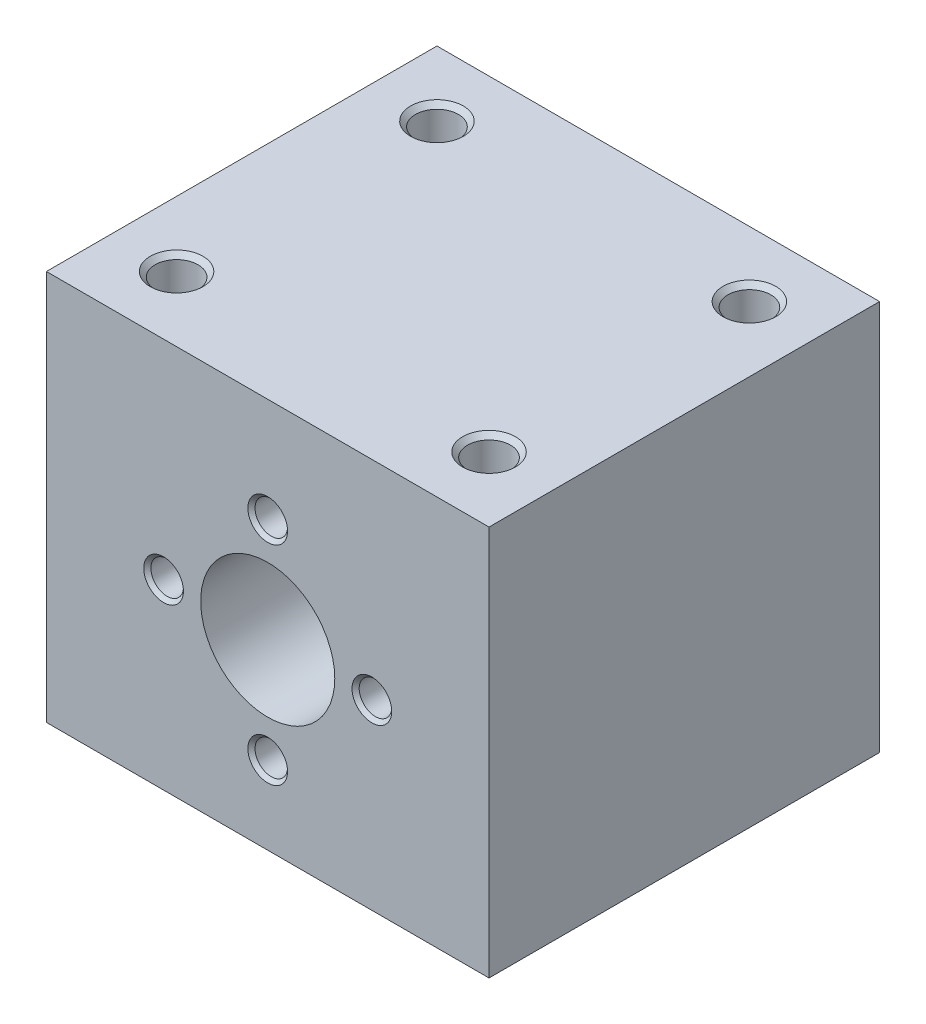
ISO-10303-21;
HEADER;
FILE_DESCRIPTION(('STEP AP214'),'2;1');
FILE_NAME('part.step','',(''),(''),'','','');
FILE_SCHEMA(('AUTOMOTIVE_DESIGN { 1 0 10303 214 1 1 1 1 }'));
ENDSEC;
DATA;
#1=APPLICATION_CONTEXT('core data for automotive mechanical design processes');
#2=APPLICATION_PROTOCOL_DEFINITION('international standard','automotive_design',2000,#1);
#3=PRODUCT_CONTEXT('',#1,'mechanical');
#4=PRODUCT('Part','Part','',(#3));
#5=PRODUCT_RELATED_PRODUCT_CATEGORY('part','',(#4));
#6=PRODUCT_DEFINITION_FORMATION('','',#4);
#7=PRODUCT_DEFINITION_CONTEXT('part definition',#1,'design');
#8=PRODUCT_DEFINITION('design','',#6,#7);
#9=PRODUCT_DEFINITION_SHAPE('','',#8);
#10=(LENGTH_UNIT() NAMED_UNIT(*) SI_UNIT(.MILLI.,.METRE.));
#11=(NAMED_UNIT(*) PLANE_ANGLE_UNIT() SI_UNIT($,.RADIAN.));
#12=(NAMED_UNIT(*) SI_UNIT($,.STERADIAN.) SOLID_ANGLE_UNIT());
#13=UNCERTAINTY_MEASURE_WITH_UNIT(LENGTH_MEASURE(1.E-05),#10,'distance_accuracy_value','');
#14=(GEOMETRIC_REPRESENTATION_CONTEXT(3) GLOBAL_UNCERTAINTY_ASSIGNED_CONTEXT((#13)) GLOBAL_UNIT_ASSIGNED_CONTEXT((#10,
#11,#12)) REPRESENTATION_CONTEXT('',''));
#15=CARTESIAN_POINT('',(0.,0.,0.));
#16=DIRECTION('',(0.,0.,1.));
#17=DIRECTION('',(1.,0.,0.));
#18=AXIS2_PLACEMENT_3D('',#15,#16,#17);
#19=CARTESIAN_POINT('',(0.,0.,30.));
#20=DIRECTION('',(0.,0.,-1.));
#21=DIRECTION('',(-1.,0.,0.));
#22=AXIS2_PLACEMENT_3D('',#19,#20,#21);
#23=PLANE('',#22);
#24=CARTESIAN_POINT('',(0.,8.,30.));
#25=DIRECTION('',(0.,0.,1.));
#26=DIRECTION('',(1.,0.,0.));
#27=AXIS2_PLACEMENT_3D('',#24,#25,#26);
#28=CIRCLE('',#27,1.525);
#29=CARTESIAN_POINT('',(1.525,8.,30.));
#30=VERTEX_POINT('',#29);
#31=EDGE_CURVE('E137',#30,#30,#28,.T.);
#32=ORIENTED_EDGE('',*,*,#31,.F.);
#33=EDGE_LOOP('',(#32));
#34=FACE_BOUND('',#33,.T.);
#35=CARTESIAN_POINT('',(-8.,0.,30.));
#36=DIRECTION('',(0.,0.,1.));
#37=DIRECTION('',(1.,0.,0.));
#38=AXIS2_PLACEMENT_3D('',#35,#36,#37);
#39=CIRCLE('',#38,1.525);
#40=CARTESIAN_POINT('',(-6.475,0.,30.));
#41=VERTEX_POINT('',#40);
#42=EDGE_CURVE('E128',#41,#41,#39,.T.);
#43=ORIENTED_EDGE('',*,*,#42,.F.);
#44=EDGE_LOOP('',(#43));
#45=FACE_BOUND('',#44,.T.);
#46=CARTESIAN_POINT('',(8.,0.,30.));
#47=DIRECTION('',(0.,0.,1.));
#48=DIRECTION('',(1.,0.,0.));
#49=AXIS2_PLACEMENT_3D('',#46,#47,#48);
#50=CIRCLE('',#49,1.525);
#51=CARTESIAN_POINT('',(9.525,0.,30.));
#52=VERTEX_POINT('',#51);
#53=EDGE_CURVE('E148',#52,#52,#50,.T.);
#54=ORIENTED_EDGE('',*,*,#53,.F.);
#55=EDGE_LOOP('',(#54));
#56=FACE_BOUND('',#55,.T.);
#57=CARTESIAN_POINT('',(0.,-8.,30.));
#58=DIRECTION('',(0.,0.,1.));
#59=DIRECTION('',(1.,0.,0.));
#60=AXIS2_PLACEMENT_3D('',#57,#58,#59);
#61=CIRCLE('',#60,1.525);
#62=CARTESIAN_POINT('',(1.525,-8.,30.));
#63=VERTEX_POINT('',#62);
#64=EDGE_CURVE('E160',#63,#63,#61,.T.);
#65=ORIENTED_EDGE('',*,*,#64,.F.);
#66=EDGE_LOOP('',(#65));
#67=FACE_BOUND('',#66,.T.);
#68=DIRECTION('',(0.,-1.,0.));
#69=VECTOR('',#68,1.);
#70=CARTESIAN_POINT('',(-17.,-14.,30.));
#71=LINE('',#70,#69);
#72=CARTESIAN_POINT('',(-17.,16.,30.));
#73=VERTEX_POINT('',#72);
#74=CARTESIAN_POINT('',(-17.,-14.,30.));
#75=VERTEX_POINT('',#74);
#76=EDGE_CURVE('E229',#73,#75,#71,.T.);
#77=ORIENTED_EDGE('',*,*,#76,.T.);
#78=DIRECTION('',(1.,0.,0.));
#79=VECTOR('',#78,1.);
#80=CARTESIAN_POINT('',(-17.,-14.,30.));
#81=LINE('',#80,#79);
#82=CARTESIAN_POINT('',(17.,-14.,30.));
#83=VERTEX_POINT('',#82);
#84=EDGE_CURVE('E92',#75,#83,#81,.T.);
#85=ORIENTED_EDGE('',*,*,#84,.T.);
#86=DIRECTION('',(0.,1.,0.));
#87=VECTOR('',#86,1.);
#88=CARTESIAN_POINT('',(17.,-14.,30.));
#89=LINE('',#88,#87);
#90=CARTESIAN_POINT('',(17.,16.,30.));
#91=VERTEX_POINT('',#90);
#92=EDGE_CURVE('E234',#83,#91,#89,.T.);
#93=ORIENTED_EDGE('',*,*,#92,.T.);
#94=DIRECTION('',(-1.,0.,0.));
#95=VECTOR('',#94,1.);
#96=CARTESIAN_POINT('',(-17.,16.,30.));
#97=LINE('',#96,#95);
#98=EDGE_CURVE('E61',#91,#73,#97,.T.);
#99=ORIENTED_EDGE('',*,*,#98,.T.);
#100=EDGE_LOOP('',(#77,#85,#93,#99));
#101=FACE_BOUND('',#100,.T.);
#102=CARTESIAN_POINT('',(0.,0.,30.));
#103=DIRECTION('',(0.,0.,1.));
#104=DIRECTION('',(1.,0.,0.));
#105=AXIS2_PLACEMENT_3D('',#102,#103,#104);
#106=CIRCLE('',#105,5.15);
#107=CARTESIAN_POINT('',(5.15,0.,30.));
#108=VERTEX_POINT('',#107);
#109=EDGE_CURVE('E221',#108,#108,#106,.T.);
#110=ORIENTED_EDGE('',*,*,#109,.F.);
#111=EDGE_LOOP('',(#110));
#112=FACE_BOUND('',#111,.T.);
#113=ADVANCED_FACE('F43',(#34,#45,#56,#67,#101,#112),#23,.F.);
#114=CARTESIAN_POINT('',(0.,0.,0.));
#115=DIRECTION('',(0.,0.,-1.));
#116=DIRECTION('',(-1.,0.,0.));
#117=AXIS2_PLACEMENT_3D('',#114,#115,#116);
#118=PLANE('',#117);
#119=DIRECTION('',(0.,-1.,0.));
#120=VECTOR('',#119,1.);
#121=CARTESIAN_POINT('',(-17.,-14.,0.));
#122=LINE('',#121,#120);
#123=CARTESIAN_POINT('',(-17.,16.,0.));
#124=VERTEX_POINT('',#123);
#125=CARTESIAN_POINT('',(-17.,-14.,0.));
#126=VERTEX_POINT('',#125);
#127=EDGE_CURVE('E225',#124,#126,#122,.T.);
#128=ORIENTED_EDGE('',*,*,#127,.F.);
#129=DIRECTION('',(-1.,0.,0.));
#130=VECTOR('',#129,1.);
#131=CARTESIAN_POINT('',(-17.,16.,0.));
#132=LINE('',#131,#130);
#133=CARTESIAN_POINT('',(17.,16.,0.));
#134=VERTEX_POINT('',#133);
#135=EDGE_CURVE('E85',#134,#124,#132,.T.);
#136=ORIENTED_EDGE('',*,*,#135,.F.);
#137=DIRECTION('',(0.,1.,0.));
#138=VECTOR('',#137,1.);
#139=CARTESIAN_POINT('',(17.,-14.,0.));
#140=LINE('',#139,#138);
#141=CARTESIAN_POINT('',(17.,-14.,0.));
#142=VERTEX_POINT('',#141);
#143=EDGE_CURVE('E79',#142,#134,#140,.T.);
#144=ORIENTED_EDGE('',*,*,#143,.F.);
#145=DIRECTION('',(1.,0.,0.));
#146=VECTOR('',#145,1.);
#147=CARTESIAN_POINT('',(-17.,-14.,0.));
#148=LINE('',#147,#146);
#149=EDGE_CURVE('E243',#126,#142,#148,.T.);
#150=ORIENTED_EDGE('',*,*,#149,.F.);
#151=EDGE_LOOP('',(#128,#136,#144,#150));
#152=FACE_BOUND('',#151,.T.);
#153=CARTESIAN_POINT('',(0.,0.,0.));
#154=DIRECTION('',(0.,0.,1.));
#155=DIRECTION('',(1.,0.,0.));
#156=AXIS2_PLACEMENT_3D('',#153,#154,#155);
#157=CIRCLE('',#156,5.15);
#158=CARTESIAN_POINT('',(5.15,0.,0.));
#159=VERTEX_POINT('',#158);
#160=EDGE_CURVE('E220',#159,#159,#157,.T.);
#161=ORIENTED_EDGE('',*,*,#160,.T.);
#162=EDGE_LOOP('',(#161));
#163=FACE_BOUND('',#162,.T.);
#164=ADVANCED_FACE('F259',(#152,#163),#118,.T.);
#165=CARTESIAN_POINT('',(-17.,-14.,30.));
#166=DIRECTION('',(1.,0.,0.));
#167=DIRECTION('',(0.,1.,0.));
#168=AXIS2_PLACEMENT_3D('',#165,#166,#167);
#169=PLANE('',#168);
#170=ORIENTED_EDGE('',*,*,#127,.T.);
#171=DIRECTION('',(0.,0.,-1.));
#172=VECTOR('',#171,1.);
#173=CARTESIAN_POINT('',(-17.,-14.,30.));
#174=LINE('',#173,#172);
#175=EDGE_CURVE('E11',#75,#126,#174,.T.);
#176=ORIENTED_EDGE('',*,*,#175,.F.);
#177=ORIENTED_EDGE('',*,*,#76,.F.);
#178=DIRECTION('',(0.,0.,-1.));
#179=VECTOR('',#178,1.);
#180=CARTESIAN_POINT('',(-17.,16.,30.));
#181=LINE('',#180,#179);
#182=EDGE_CURVE('E239',#73,#124,#181,.T.);
#183=ORIENTED_EDGE('',*,*,#182,.T.);
#184=EDGE_LOOP('',(#170,#176,#177,#183));
#185=FACE_BOUND('',#184,.T.);
#186=ADVANCED_FACE('F45',(#185),#169,.F.);
#187=CARTESIAN_POINT('',(-17.,-14.,30.));
#188=DIRECTION('',(0.,1.,0.));
#189=DIRECTION('',(-1.,0.,0.));
#190=AXIS2_PLACEMENT_3D('',#187,#188,#189);
#191=PLANE('',#190);
#192=ORIENTED_EDGE('',*,*,#149,.T.);
#193=DIRECTION('',(0.,0.,-1.));
#194=VECTOR('',#193,1.);
#195=CARTESIAN_POINT('',(17.,-14.,30.));
#196=LINE('',#195,#194);
#197=EDGE_CURVE('E53',#83,#142,#196,.T.);
#198=ORIENTED_EDGE('',*,*,#197,.F.);
#199=ORIENTED_EDGE('',*,*,#84,.F.);
#200=ORIENTED_EDGE('',*,*,#175,.T.);
#201=EDGE_LOOP('',(#192,#198,#199,#200));
#202=FACE_BOUND('',#201,.T.);
#203=ADVANCED_FACE('F276',(#202),#191,.F.);
#204=CARTESIAN_POINT('',(17.,-14.,30.));
#205=DIRECTION('',(-1.,0.,0.));
#206=DIRECTION('',(0.,-1.,0.));
#207=AXIS2_PLACEMENT_3D('',#204,#205,#206);
#208=PLANE('',#207);
#209=ORIENTED_EDGE('',*,*,#143,.T.);
#210=DIRECTION('',(0.,0.,-1.));
#211=VECTOR('',#210,1.);
#212=CARTESIAN_POINT('',(17.,16.,30.));
#213=LINE('',#212,#211);
#214=EDGE_CURVE('E252',#91,#134,#213,.T.);
#215=ORIENTED_EDGE('',*,*,#214,.F.);
#216=ORIENTED_EDGE('',*,*,#92,.F.);
#217=ORIENTED_EDGE('',*,*,#197,.T.);
#218=EDGE_LOOP('',(#209,#215,#216,#217));
#219=FACE_BOUND('',#218,.T.);
#220=ADVANCED_FACE('F256',(#219),#208,.F.);
#221=CARTESIAN_POINT('',(-17.,16.,30.));
#222=DIRECTION('',(0.,-1.,0.));
#223=DIRECTION('',(1.,0.,0.));
#224=AXIS2_PLACEMENT_3D('',#221,#222,#223);
#225=PLANE('',#224);
#226=CARTESIAN_POINT('',(-12.,16.,5.));
#227=DIRECTION('',(0.,1.,0.));
#228=DIRECTION('',(0.,0.,1.));
#229=AXIS2_PLACEMENT_3D('',#226,#227,#228);
#230=CIRCLE('',#229,2.025);
#231=CARTESIAN_POINT('',(-12.,16.,7.025));
#232=VERTEX_POINT('',#231);
#233=EDGE_CURVE('E172',#232,#232,#230,.T.);
#234=ORIENTED_EDGE('',*,*,#233,.F.);
#235=EDGE_LOOP('',(#234));
#236=FACE_BOUND('',#235,.T.);
#237=CARTESIAN_POINT('',(12.,16.,5.));
#238=DIRECTION('',(0.,1.,0.));
#239=DIRECTION('',(0.,0.,1.));
#240=AXIS2_PLACEMENT_3D('',#237,#238,#239);
#241=CIRCLE('',#240,2.025);
#242=CARTESIAN_POINT('',(12.,16.,7.025));
#243=VERTEX_POINT('',#242);
#244=EDGE_CURVE('E184',#243,#243,#241,.T.);
#245=ORIENTED_EDGE('',*,*,#244,.F.);
#246=EDGE_LOOP('',(#245));
#247=FACE_BOUND('',#246,.T.);
#248=CARTESIAN_POINT('',(-12.,16.,25.));
#249=DIRECTION('',(0.,1.,0.));
#250=DIRECTION('',(0.,0.,1.));
#251=AXIS2_PLACEMENT_3D('',#248,#249,#250);
#252=CIRCLE('',#251,2.025);
#253=CARTESIAN_POINT('',(-12.,16.,27.025));
#254=VERTEX_POINT('',#253);
#255=EDGE_CURVE('E196',#254,#254,#252,.T.);
#256=ORIENTED_EDGE('',*,*,#255,.F.);
#257=EDGE_LOOP('',(#256));
#258=FACE_BOUND('',#257,.T.);
#259=CARTESIAN_POINT('',(12.,16.,25.));
#260=DIRECTION('',(0.,1.,0.));
#261=DIRECTION('',(0.,0.,1.));
#262=AXIS2_PLACEMENT_3D('',#259,#260,#261);
#263=CIRCLE('',#262,2.025);
#264=CARTESIAN_POINT('',(12.,16.,27.025));
#265=VERTEX_POINT('',#264);
#266=EDGE_CURVE('E208',#265,#265,#263,.T.);
#267=ORIENTED_EDGE('',*,*,#266,.F.);
#268=EDGE_LOOP('',(#267));
#269=FACE_BOUND('',#268,.T.);
#270=ORIENTED_EDGE('',*,*,#135,.T.);
#271=ORIENTED_EDGE('',*,*,#182,.F.);
#272=ORIENTED_EDGE('',*,*,#98,.F.);
#273=ORIENTED_EDGE('',*,*,#214,.T.);
#274=EDGE_LOOP('',(#270,#271,#272,#273));
#275=FACE_BOUND('',#274,.T.);
#276=ADVANCED_FACE('F264',(#236,#247,#258,#269,#275),#225,.F.);
#277=CARTESIAN_POINT('',(0.,0.,30.));
#278=DIRECTION('',(0.,0.,-1.));
#279=DIRECTION('',(-1.,0.,0.));
#280=AXIS2_PLACEMENT_3D('',#277,#278,#279);
#281=CYLINDRICAL_SURFACE('',#280,5.15);
#282=ORIENTED_EDGE('',*,*,#109,.T.);
#283=EDGE_LOOP('',(#282));
#284=FACE_BOUND('',#283,.T.);
#285=ORIENTED_EDGE('',*,*,#160,.F.);
#286=EDGE_LOOP('',(#285));
#287=FACE_BOUND('',#286,.T.);
#288=ADVANCED_FACE('F266',(#284,#287),#281,.F.);
#289=CARTESIAN_POINT('',(12.,3.9,25.));
#290=DIRECTION('',(0.,1.,0.));
#291=DIRECTION('',(0.,0.,1.));
#292=AXIS2_PLACEMENT_3D('',#289,#290,#291);
#293=CONICAL_SURFACE('',#292,1.64999999999999,1.02974425867665);
#294=CARTESIAN_POINT('',(12.,2.90857997860452,25.));
#295=VERTEX_POINT('',#294);
#296=VERTEX_LOOP('',#295);
#297=FACE_BOUND('',#296,.T.);
#298=CARTESIAN_POINT('',(12.,3.9,25.));
#299=DIRECTION('',(0.,1.,0.));
#300=DIRECTION('',(0.,0.,1.));
#301=AXIS2_PLACEMENT_3D('',#298,#299,#300);
#302=CIRCLE('',#301,1.64999999999999);
#303=CARTESIAN_POINT('',(12.,3.9,26.65));
#304=VERTEX_POINT('',#303);
#305=EDGE_CURVE('E216',#304,#304,#302,.T.);
#306=ORIENTED_EDGE('',*,*,#305,.T.);
#307=EDGE_LOOP('',(#306));
#308=FACE_BOUND('',#307,.T.);
#309=ADVANCED_FACE('F273',(#297,#308),#293,.F.);
#310=CARTESIAN_POINT('',(12.,16.,25.));
#311=DIRECTION('',(0.,1.,0.));
#312=DIRECTION('',(0.,0.,1.));
#313=AXIS2_PLACEMENT_3D('',#310,#311,#312);
#314=CYLINDRICAL_SURFACE('',#313,1.64999999999999);
#315=ORIENTED_EDGE('',*,*,#305,.F.);
#316=EDGE_LOOP('',(#315));
#317=FACE_BOUND('',#316,.T.);
#318=CARTESIAN_POINT('',(12.,15.625,25.));
#319=DIRECTION('',(0.,1.,0.));
#320=DIRECTION('',(0.,0.,1.));
#321=AXIS2_PLACEMENT_3D('',#318,#319,#320);
#322=CIRCLE('',#321,1.64999999999999);
#323=CARTESIAN_POINT('',(12.,15.625,26.65));
#324=VERTEX_POINT('',#323);
#325=EDGE_CURVE('E212',#324,#324,#322,.T.);
#326=ORIENTED_EDGE('',*,*,#325,.T.);
#327=EDGE_LOOP('',(#326));
#328=FACE_BOUND('',#327,.T.);
#329=ADVANCED_FACE('F292',(#317,#328),#314,.F.);
#330=CARTESIAN_POINT('',(12.,16.,25.));
#331=DIRECTION('',(0.,1.,0.));
#332=DIRECTION('',(0.,0.,1.));
#333=AXIS2_PLACEMENT_3D('',#330,#331,#332);
#334=CONICAL_SURFACE('',#333,2.025,0.785398163397455);
#335=ORIENTED_EDGE('',*,*,#325,.F.);
#336=EDGE_LOOP('',(#335));
#337=FACE_BOUND('',#336,.T.);
#338=ORIENTED_EDGE('',*,*,#266,.T.);
#339=EDGE_LOOP('',(#338));
#340=FACE_BOUND('',#339,.T.);
#341=ADVANCED_FACE('F296',(#337,#340),#334,.F.);
#342=CARTESIAN_POINT('',(-12.,3.9,25.));
#343=DIRECTION('',(0.,1.,0.));
#344=DIRECTION('',(0.,0.,1.));
#345=AXIS2_PLACEMENT_3D('',#342,#343,#344);
#346=CONICAL_SURFACE('',#345,1.64999999999999,1.02974425867665);
#347=CARTESIAN_POINT('',(-12.,2.90857997860452,25.));
#348=VERTEX_POINT('',#347);
#349=VERTEX_LOOP('',#348);
#350=FACE_BOUND('',#349,.T.);
#351=CARTESIAN_POINT('',(-12.,3.9,25.));
#352=DIRECTION('',(0.,1.,0.));
#353=DIRECTION('',(0.,0.,1.));
#354=AXIS2_PLACEMENT_3D('',#351,#352,#353);
#355=CIRCLE('',#354,1.64999999999999);
#356=CARTESIAN_POINT('',(-12.,3.9,26.65));
#357=VERTEX_POINT('',#356);
#358=EDGE_CURVE('E204',#357,#357,#355,.T.);
#359=ORIENTED_EDGE('',*,*,#358,.T.);
#360=EDGE_LOOP('',(#359));
#361=FACE_BOUND('',#360,.T.);
#362=ADVANCED_FACE('F300',(#350,#361),#346,.F.);
#363=CARTESIAN_POINT('',(-12.,16.,25.));
#364=DIRECTION('',(0.,1.,0.));
#365=DIRECTION('',(0.,0.,1.));
#366=AXIS2_PLACEMENT_3D('',#363,#364,#365);
#367=CYLINDRICAL_SURFACE('',#366,1.64999999999999);
#368=ORIENTED_EDGE('',*,*,#358,.F.);
#369=EDGE_LOOP('',(#368));
#370=FACE_BOUND('',#369,.T.);
#371=CARTESIAN_POINT('',(-12.,15.625,25.));
#372=DIRECTION('',(0.,1.,0.));
#373=DIRECTION('',(0.,0.,1.));
#374=AXIS2_PLACEMENT_3D('',#371,#372,#373);
#375=CIRCLE('',#374,1.64999999999999);
#376=CARTESIAN_POINT('',(-12.,15.625,26.65));
#377=VERTEX_POINT('',#376);
#378=EDGE_CURVE('E200',#377,#377,#375,.T.);
#379=ORIENTED_EDGE('',*,*,#378,.T.);
#380=EDGE_LOOP('',(#379));
#381=FACE_BOUND('',#380,.T.);
#382=ADVANCED_FACE('F304',(#370,#381),#367,.F.);
#383=CARTESIAN_POINT('',(-12.,16.,25.));
#384=DIRECTION('',(0.,1.,0.));
#385=DIRECTION('',(0.,0.,1.));
#386=AXIS2_PLACEMENT_3D('',#383,#384,#385);
#387=CONICAL_SURFACE('',#386,2.025,0.785398163397455);
#388=ORIENTED_EDGE('',*,*,#378,.F.);
#389=EDGE_LOOP('',(#388));
#390=FACE_BOUND('',#389,.T.);
#391=ORIENTED_EDGE('',*,*,#255,.T.);
#392=EDGE_LOOP('',(#391));
#393=FACE_BOUND('',#392,.T.);
#394=ADVANCED_FACE('F308',(#390,#393),#387,.F.);
#395=CARTESIAN_POINT('',(12.,3.9,5.));
#396=DIRECTION('',(0.,1.,0.));
#397=DIRECTION('',(0.,0.,1.));
#398=AXIS2_PLACEMENT_3D('',#395,#396,#397);
#399=CONICAL_SURFACE('',#398,1.64999999999999,1.02974425867665);
#400=CARTESIAN_POINT('',(12.,2.90857997860452,5.));
#401=VERTEX_POINT('',#400);
#402=VERTEX_LOOP('',#401);
#403=FACE_BOUND('',#402,.T.);
#404=CARTESIAN_POINT('',(12.,3.9,5.));
#405=DIRECTION('',(0.,1.,0.));
#406=DIRECTION('',(0.,0.,1.));
#407=AXIS2_PLACEMENT_3D('',#404,#405,#406);
#408=CIRCLE('',#407,1.64999999999999);
#409=CARTESIAN_POINT('',(12.,3.9,6.64999999999999));
#410=VERTEX_POINT('',#409);
#411=EDGE_CURVE('E192',#410,#410,#408,.T.);
#412=ORIENTED_EDGE('',*,*,#411,.T.);
#413=EDGE_LOOP('',(#412));
#414=FACE_BOUND('',#413,.T.);
#415=ADVANCED_FACE('F312',(#403,#414),#399,.F.);
#416=CARTESIAN_POINT('',(12.,16.,5.));
#417=DIRECTION('',(0.,1.,0.));
#418=DIRECTION('',(0.,0.,1.));
#419=AXIS2_PLACEMENT_3D('',#416,#417,#418);
#420=CYLINDRICAL_SURFACE('',#419,1.64999999999999);
#421=ORIENTED_EDGE('',*,*,#411,.F.);
#422=EDGE_LOOP('',(#421));
#423=FACE_BOUND('',#422,.T.);
#424=CARTESIAN_POINT('',(12.,15.625,5.));
#425=DIRECTION('',(0.,1.,0.));
#426=DIRECTION('',(0.,0.,1.));
#427=AXIS2_PLACEMENT_3D('',#424,#425,#426);
#428=CIRCLE('',#427,1.64999999999999);
#429=CARTESIAN_POINT('',(12.,15.625,6.64999999999999));
#430=VERTEX_POINT('',#429);
#431=EDGE_CURVE('E188',#430,#430,#428,.T.);
#432=ORIENTED_EDGE('',*,*,#431,.T.);
#433=EDGE_LOOP('',(#432));
#434=FACE_BOUND('',#433,.T.);
#435=ADVANCED_FACE('F316',(#423,#434),#420,.F.);
#436=CARTESIAN_POINT('',(12.,16.,5.));
#437=DIRECTION('',(0.,1.,0.));
#438=DIRECTION('',(0.,0.,1.));
#439=AXIS2_PLACEMENT_3D('',#436,#437,#438);
#440=CONICAL_SURFACE('',#439,2.025,0.785398163397455);
#441=ORIENTED_EDGE('',*,*,#431,.F.);
#442=EDGE_LOOP('',(#441));
#443=FACE_BOUND('',#442,.T.);
#444=ORIENTED_EDGE('',*,*,#244,.T.);
#445=EDGE_LOOP('',(#444));
#446=FACE_BOUND('',#445,.T.);
#447=ADVANCED_FACE('F320',(#443,#446),#440,.F.);
#448=CARTESIAN_POINT('',(-12.,3.9,5.));
#449=DIRECTION('',(0.,1.,0.));
#450=DIRECTION('',(0.,0.,1.));
#451=AXIS2_PLACEMENT_3D('',#448,#449,#450);
#452=CONICAL_SURFACE('',#451,1.64999999999999,1.02974425867665);
#453=CARTESIAN_POINT('',(-12.,2.90857997860452,5.));
#454=VERTEX_POINT('',#453);
#455=VERTEX_LOOP('',#454);
#456=FACE_BOUND('',#455,.T.);
#457=CARTESIAN_POINT('',(-12.,3.9,5.));
#458=DIRECTION('',(0.,1.,0.));
#459=DIRECTION('',(0.,0.,1.));
#460=AXIS2_PLACEMENT_3D('',#457,#458,#459);
#461=CIRCLE('',#460,1.64999999999999);
#462=CARTESIAN_POINT('',(-12.,3.9,6.64999999999999));
#463=VERTEX_POINT('',#462);
#464=EDGE_CURVE('E180',#463,#463,#461,.T.);
#465=ORIENTED_EDGE('',*,*,#464,.T.);
#466=EDGE_LOOP('',(#465));
#467=FACE_BOUND('',#466,.T.);
#468=ADVANCED_FACE('F324',(#456,#467),#452,.F.);
#469=CARTESIAN_POINT('',(-12.,16.,5.));
#470=DIRECTION('',(0.,1.,0.));
#471=DIRECTION('',(0.,0.,1.));
#472=AXIS2_PLACEMENT_3D('',#469,#470,#471);
#473=CYLINDRICAL_SURFACE('',#472,1.64999999999999);
#474=ORIENTED_EDGE('',*,*,#464,.F.);
#475=EDGE_LOOP('',(#474));
#476=FACE_BOUND('',#475,.T.);
#477=CARTESIAN_POINT('',(-12.,15.625,5.));
#478=DIRECTION('',(0.,1.,0.));
#479=DIRECTION('',(0.,0.,1.));
#480=AXIS2_PLACEMENT_3D('',#477,#478,#479);
#481=CIRCLE('',#480,1.64999999999999);
#482=CARTESIAN_POINT('',(-12.,15.625,6.64999999999999));
#483=VERTEX_POINT('',#482);
#484=EDGE_CURVE('E176',#483,#483,#481,.T.);
#485=ORIENTED_EDGE('',*,*,#484,.T.);
#486=EDGE_LOOP('',(#485));
#487=FACE_BOUND('',#486,.T.);
#488=ADVANCED_FACE('F328',(#476,#487),#473,.F.);
#489=CARTESIAN_POINT('',(-12.,16.,5.));
#490=DIRECTION('',(0.,1.,0.));
#491=DIRECTION('',(0.,0.,1.));
#492=AXIS2_PLACEMENT_3D('',#489,#490,#491);
#493=CONICAL_SURFACE('',#492,2.025,0.785398163397455);
#494=ORIENTED_EDGE('',*,*,#484,.F.);
#495=EDGE_LOOP('',(#494));
#496=FACE_BOUND('',#495,.T.);
#497=ORIENTED_EDGE('',*,*,#233,.T.);
#498=EDGE_LOOP('',(#497));
#499=FACE_BOUND('',#498,.T.);
#500=ADVANCED_FACE('F332',(#496,#499),#493,.F.);
#501=CARTESIAN_POINT('',(0.,-8.,22.5));
#502=DIRECTION('',(0.,0.,1.));
#503=DIRECTION('',(1.,0.,0.));
#504=AXIS2_PLACEMENT_3D('',#501,#502,#503);
#505=CONICAL_SURFACE('',#504,1.25,1.02974425867665);
#506=CARTESIAN_POINT('',(0.,-8.,21.7489242262155));
#507=VERTEX_POINT('',#506);
#508=VERTEX_LOOP('',#507);
#509=FACE_BOUND('',#508,.T.);
#510=CARTESIAN_POINT('',(0.,-8.,22.5));
#511=DIRECTION('',(0.,0.,1.));
#512=DIRECTION('',(1.,0.,0.));
#513=AXIS2_PLACEMENT_3D('',#510,#511,#512);
#514=CIRCLE('',#513,1.25);
#515=CARTESIAN_POINT('',(1.25,-8.,22.5));
#516=VERTEX_POINT('',#515);
#517=EDGE_CURVE('E168',#516,#516,#514,.T.);
#518=ORIENTED_EDGE('',*,*,#517,.T.);
#519=EDGE_LOOP('',(#518));
#520=FACE_BOUND('',#519,.T.);
#521=ADVANCED_FACE('F336',(#509,#520),#505,.F.);
#522=CARTESIAN_POINT('',(0.,-8.,30.));
#523=DIRECTION('',(0.,0.,1.));
#524=DIRECTION('',(1.,0.,0.));
#525=AXIS2_PLACEMENT_3D('',#522,#523,#524);
#526=CYLINDRICAL_SURFACE('',#525,1.25);
#527=ORIENTED_EDGE('',*,*,#517,.F.);
#528=EDGE_LOOP('',(#527));
#529=FACE_BOUND('',#528,.T.);
#530=CARTESIAN_POINT('',(0.,-8.,29.725));
#531=DIRECTION('',(0.,0.,1.));
#532=DIRECTION('',(1.,0.,0.));
#533=AXIS2_PLACEMENT_3D('',#530,#531,#532);
#534=CIRCLE('',#533,1.25);
#535=CARTESIAN_POINT('',(1.25,-8.,29.725));
#536=VERTEX_POINT('',#535);
#537=EDGE_CURVE('E164',#536,#536,#534,.T.);
#538=ORIENTED_EDGE('',*,*,#537,.T.);
#539=EDGE_LOOP('',(#538));
#540=FACE_BOUND('',#539,.T.);
#541=ADVANCED_FACE('F340',(#529,#540),#526,.F.);
#542=CARTESIAN_POINT('',(0.,-8.,30.));
#543=DIRECTION('',(0.,0.,1.));
#544=DIRECTION('',(1.,0.,0.));
#545=AXIS2_PLACEMENT_3D('',#542,#543,#544);
#546=CONICAL_SURFACE('',#545,1.525,0.785398163397448);
#547=ORIENTED_EDGE('',*,*,#537,.F.);
#548=EDGE_LOOP('',(#547));
#549=FACE_BOUND('',#548,.T.);
#550=ORIENTED_EDGE('',*,*,#64,.T.);
#551=EDGE_LOOP('',(#550));
#552=FACE_BOUND('',#551,.T.);
#553=ADVANCED_FACE('F344',(#549,#552),#546,.F.);
#554=CARTESIAN_POINT('',(8.,0.,22.5));
#555=DIRECTION('',(0.,0.,1.));
#556=DIRECTION('',(1.,0.,0.));
#557=AXIS2_PLACEMENT_3D('',#554,#555,#556);
#558=CONICAL_SURFACE('',#557,1.25,1.02974425867665);
#559=CARTESIAN_POINT('',(8.,0.,21.7489242262155));
#560=VERTEX_POINT('',#559);
#561=VERTEX_LOOP('',#560);
#562=FACE_BOUND('',#561,.T.);
#563=CARTESIAN_POINT('',(8.,0.,22.5));
#564=DIRECTION('',(0.,0.,1.));
#565=DIRECTION('',(1.,0.,0.));
#566=AXIS2_PLACEMENT_3D('',#563,#564,#565);
#567=CIRCLE('',#566,1.25);
#568=CARTESIAN_POINT('',(9.25,0.,22.5));
#569=VERTEX_POINT('',#568);
#570=EDGE_CURVE('E156',#569,#569,#567,.T.);
#571=ORIENTED_EDGE('',*,*,#570,.T.);
#572=EDGE_LOOP('',(#571));
#573=FACE_BOUND('',#572,.T.);
#574=ADVANCED_FACE('F348',(#562,#573),#558,.F.);
#575=CARTESIAN_POINT('',(8.,0.,30.));
#576=DIRECTION('',(0.,0.,1.));
#577=DIRECTION('',(1.,0.,0.));
#578=AXIS2_PLACEMENT_3D('',#575,#576,#577);
#579=CYLINDRICAL_SURFACE('',#578,1.25);
#580=ORIENTED_EDGE('',*,*,#570,.F.);
#581=EDGE_LOOP('',(#580));
#582=FACE_BOUND('',#581,.T.);
#583=CARTESIAN_POINT('',(8.,0.,29.725));
#584=DIRECTION('',(0.,0.,1.));
#585=DIRECTION('',(1.,0.,0.));
#586=AXIS2_PLACEMENT_3D('',#583,#584,#585);
#587=CIRCLE('',#586,1.25);
#588=CARTESIAN_POINT('',(9.25,0.,29.725));
#589=VERTEX_POINT('',#588);
#590=EDGE_CURVE('E152',#589,#589,#587,.T.);
#591=ORIENTED_EDGE('',*,*,#590,.T.);
#592=EDGE_LOOP('',(#591));
#593=FACE_BOUND('',#592,.T.);
#594=ADVANCED_FACE('F352',(#582,#593),#579,.F.);
#595=CARTESIAN_POINT('',(8.,0.,30.));
#596=DIRECTION('',(0.,0.,1.));
#597=DIRECTION('',(1.,0.,0.));
#598=AXIS2_PLACEMENT_3D('',#595,#596,#597);
#599=CONICAL_SURFACE('',#598,1.525,0.785398163397448);
#600=ORIENTED_EDGE('',*,*,#590,.F.);
#601=EDGE_LOOP('',(#600));
#602=FACE_BOUND('',#601,.T.);
#603=ORIENTED_EDGE('',*,*,#53,.T.);
#604=EDGE_LOOP('',(#603));
#605=FACE_BOUND('',#604,.T.);
#606=ADVANCED_FACE('F356',(#602,#605),#599,.F.);
#607=CARTESIAN_POINT('',(-8.,0.,22.5));
#608=DIRECTION('',(0.,0.,1.));
#609=DIRECTION('',(1.,0.,0.));
#610=AXIS2_PLACEMENT_3D('',#607,#608,#609);
#611=CONICAL_SURFACE('',#610,1.25,1.02974425867665);
#612=CARTESIAN_POINT('',(-8.,0.,21.7489242262155));
#613=VERTEX_POINT('',#612);
#614=VERTEX_LOOP('',#613);
#615=FACE_BOUND('',#614,.T.);
#616=CARTESIAN_POINT('',(-8.,0.,22.5));
#617=DIRECTION('',(0.,0.,1.));
#618=DIRECTION('',(1.,0.,0.));
#619=AXIS2_PLACEMENT_3D('',#616,#617,#618);
#620=CIRCLE('',#619,1.25);
#621=CARTESIAN_POINT('',(-6.75,0.,22.5));
#622=VERTEX_POINT('',#621);
#623=EDGE_CURVE('E144',#622,#622,#620,.T.);
#624=ORIENTED_EDGE('',*,*,#623,.T.);
#625=EDGE_LOOP('',(#624));
#626=FACE_BOUND('',#625,.T.);
#627=ADVANCED_FACE('F360',(#615,#626),#611,.F.);
#628=CARTESIAN_POINT('',(-8.,0.,30.));
#629=DIRECTION('',(0.,0.,1.));
#630=DIRECTION('',(1.,0.,0.));
#631=AXIS2_PLACEMENT_3D('',#628,#629,#630);
#632=CYLINDRICAL_SURFACE('',#631,1.25);
#633=ORIENTED_EDGE('',*,*,#623,.F.);
#634=EDGE_LOOP('',(#633));
#635=FACE_BOUND('',#634,.T.);
#636=CARTESIAN_POINT('',(-8.,0.,29.725));
#637=DIRECTION('',(0.,0.,1.));
#638=DIRECTION('',(1.,0.,0.));
#639=AXIS2_PLACEMENT_3D('',#636,#637,#638);
#640=CIRCLE('',#639,1.25);
#641=CARTESIAN_POINT('',(-6.75,0.,29.725));
#642=VERTEX_POINT('',#641);
#643=EDGE_CURVE('E134',#642,#642,#640,.T.);
#644=ORIENTED_EDGE('',*,*,#643,.T.);
#645=EDGE_LOOP('',(#644));
#646=FACE_BOUND('',#645,.T.);
#647=ADVANCED_FACE('F364',(#635,#646),#632,.F.);
#648=CARTESIAN_POINT('',(-8.,0.,30.));
#649=DIRECTION('',(0.,0.,1.));
#650=DIRECTION('',(1.,0.,0.));
#651=AXIS2_PLACEMENT_3D('',#648,#649,#650);
#652=CONICAL_SURFACE('',#651,1.525,0.785398163397448);
#653=ORIENTED_EDGE('',*,*,#643,.F.);
#654=EDGE_LOOP('',(#653));
#655=FACE_BOUND('',#654,.T.);
#656=ORIENTED_EDGE('',*,*,#42,.T.);
#657=EDGE_LOOP('',(#656));
#658=FACE_BOUND('',#657,.T.);
#659=ADVANCED_FACE('F121',(#655,#658),#652,.F.);
#660=CARTESIAN_POINT('',(0.,8.,22.5));
#661=DIRECTION('',(0.,0.,1.));
#662=DIRECTION('',(1.,0.,0.));
#663=AXIS2_PLACEMENT_3D('',#660,#661,#662);
#664=CONICAL_SURFACE('',#663,1.25,1.02974425867665);
#665=CARTESIAN_POINT('',(0.,8.,21.7489242262155));
#666=VERTEX_POINT('',#665);
#667=VERTEX_LOOP('',#666);
#668=FACE_BOUND('',#667,.T.);
#669=CARTESIAN_POINT('',(0.,8.,22.5));
#670=DIRECTION('',(0.,0.,1.));
#671=DIRECTION('',(1.,0.,0.));
#672=AXIS2_PLACEMENT_3D('',#669,#670,#671);
#673=CIRCLE('',#672,1.25);
#674=CARTESIAN_POINT('',(1.25,8.,22.5));
#675=VERTEX_POINT('',#674);
#676=EDGE_CURVE('E125',#675,#675,#673,.T.);
#677=ORIENTED_EDGE('',*,*,#676,.T.);
#678=EDGE_LOOP('',(#677));
#679=FACE_BOUND('',#678,.T.);
#680=ADVANCED_FACE('F117',(#668,#679),#664,.F.);
#681=CARTESIAN_POINT('',(0.,8.,30.));
#682=DIRECTION('',(0.,0.,1.));
#683=DIRECTION('',(1.,0.,0.));
#684=AXIS2_PLACEMENT_3D('',#681,#682,#683);
#685=CYLINDRICAL_SURFACE('',#684,1.25);
#686=ORIENTED_EDGE('',*,*,#676,.F.);
#687=EDGE_LOOP('',(#686));
#688=FACE_BOUND('',#687,.T.);
#689=CARTESIAN_POINT('',(0.,8.,29.725));
#690=DIRECTION('',(0.,0.,1.));
#691=DIRECTION('',(1.,0.,0.));
#692=AXIS2_PLACEMENT_3D('',#689,#690,#691);
#693=CIRCLE('',#692,1.25);
#694=CARTESIAN_POINT('',(1.25,8.,29.725));
#695=VERTEX_POINT('',#694);
#696=EDGE_CURVE('E129',#695,#695,#693,.T.);
#697=ORIENTED_EDGE('',*,*,#696,.T.);
#698=EDGE_LOOP('',(#697));
#699=FACE_BOUND('',#698,.T.);
#700=ADVANCED_FACE('F120',(#688,#699),#685,.F.);
#701=CARTESIAN_POINT('',(0.,8.,30.));
#702=DIRECTION('',(0.,0.,1.));
#703=DIRECTION('',(1.,0.,0.));
#704=AXIS2_PLACEMENT_3D('',#701,#702,#703);
#705=CONICAL_SURFACE('',#704,1.525,0.785398163397448);
#706=ORIENTED_EDGE('',*,*,#696,.F.);
#707=EDGE_LOOP('',(#706));
#708=FACE_BOUND('',#707,.T.);
#709=ORIENTED_EDGE('',*,*,#31,.T.);
#710=EDGE_LOOP('',(#709));
#711=FACE_BOUND('',#710,.T.);
#712=ADVANCED_FACE('F374',(#708,#711),#705,.F.);
#713=CLOSED_SHELL('',(#113,#164,#186,#203,#220,#276,#288,#309,#329,#341,#362,#382,#394,#415,
#435,#447,#468,#488,#500,#521,#541,#553,#574,#594,#606,#627,#647,#659,#680,#700,#712));
#714=MANIFOLD_SOLID_BREP('B2',#713);
#715=ADVANCED_BREP_SHAPE_REPRESENTATION('',(#18,#714),#14);
#716=SHAPE_DEFINITION_REPRESENTATION(#9,#715);
ENDSEC;
END-ISO-10303-21;
